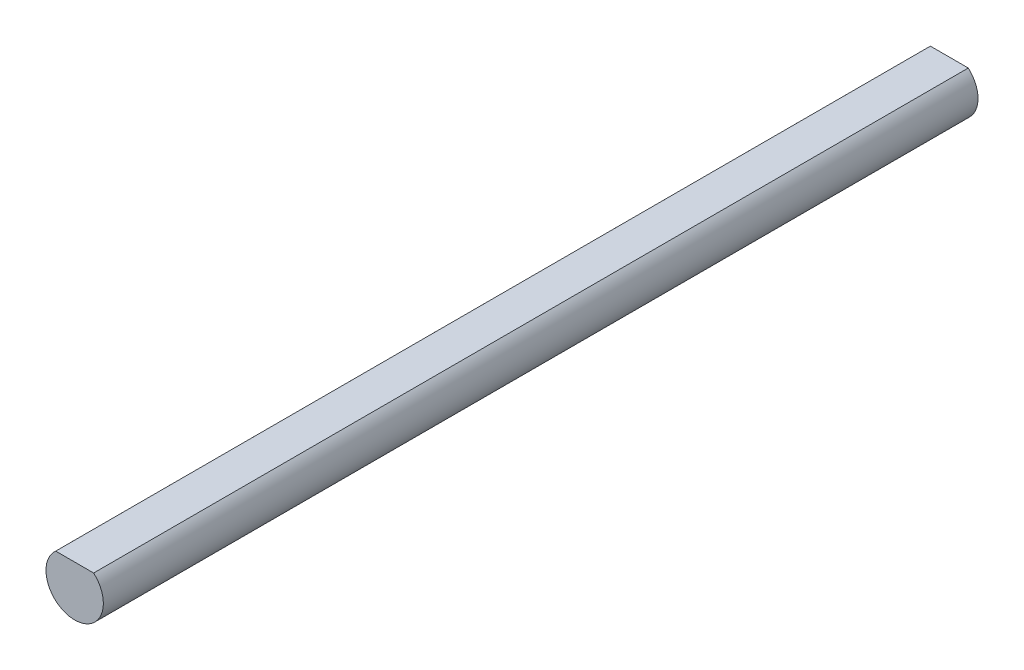
ISO-10303-21;
HEADER;
FILE_DESCRIPTION(('STEP AP214'),'2;1');
FILE_NAME('part.step','',(''),(''),'','','');
FILE_SCHEMA(('AUTOMOTIVE_DESIGN { 1 0 10303 214 1 1 1 1 }'));
ENDSEC;
DATA;
#1=APPLICATION_CONTEXT('core data for automotive mechanical design processes');
#2=APPLICATION_PROTOCOL_DEFINITION('international standard','automotive_design',2000,#1);
#3=PRODUCT_CONTEXT('',#1,'mechanical');
#4=PRODUCT('Part','Part','',(#3));
#5=PRODUCT_RELATED_PRODUCT_CATEGORY('part','',(#4));
#6=PRODUCT_DEFINITION_FORMATION('','',#4);
#7=PRODUCT_DEFINITION_CONTEXT('part definition',#1,'design');
#8=PRODUCT_DEFINITION('design','',#6,#7);
#9=PRODUCT_DEFINITION_SHAPE('','',#8);
#10=(LENGTH_UNIT() NAMED_UNIT(*) SI_UNIT(.MILLI.,.METRE.));
#11=(NAMED_UNIT(*) PLANE_ANGLE_UNIT() SI_UNIT($,.RADIAN.));
#12=(NAMED_UNIT(*) SI_UNIT($,.STERADIAN.) SOLID_ANGLE_UNIT());
#13=UNCERTAINTY_MEASURE_WITH_UNIT(LENGTH_MEASURE(1.E-05),#10,'distance_accuracy_value','');
#14=(GEOMETRIC_REPRESENTATION_CONTEXT(3) GLOBAL_UNCERTAINTY_ASSIGNED_CONTEXT((#13)) GLOBAL_UNIT_ASSIGNED_CONTEXT((#10,
#11,#12)) REPRESENTATION_CONTEXT('',''));
#15=CARTESIAN_POINT('',(0.,0.,0.));
#16=DIRECTION('',(0.,0.,1.));
#17=DIRECTION('',(1.,0.,0.));
#18=AXIS2_PLACEMENT_3D('',#15,#16,#17);
#19=CARTESIAN_POINT('',(0.,0.,-61.));
#20=DIRECTION('',(0.,0.,1.));
#21=DIRECTION('',(1.,0.,0.));
#22=AXIS2_PLACEMENT_3D('',#19,#20,#21);
#23=CYLINDRICAL_SURFACE('',#22,4.);
#24=DIRECTION('',(0.,0.,1.));
#25=VECTOR('',#24,1.);
#26=CARTESIAN_POINT('',(2.64575131106459,3.,-61.));
#27=LINE('',#26,#25);
#28=CARTESIAN_POINT('',(2.64575131106459,3.,-61.));
#29=VERTEX_POINT('',#28);
#30=CARTESIAN_POINT('',(2.64575131106459,3.,61.));
#31=VERTEX_POINT('',#30);
#32=EDGE_CURVE('E57',#29,#31,#27,.T.);
#33=ORIENTED_EDGE('',*,*,#32,.T.);
#34=CARTESIAN_POINT('',(0.,0.,61.));
#35=DIRECTION('',(0.,0.,1.));
#36=DIRECTION('',(1.,0.,0.));
#37=AXIS2_PLACEMENT_3D('',#34,#35,#36);
#38=CIRCLE('',#37,4.);
#39=CARTESIAN_POINT('',(-2.64575131106459,3.,61.));
#40=VERTEX_POINT('',#39);
#41=EDGE_CURVE('E44',#40,#31,#38,.T.);
#42=ORIENTED_EDGE('',*,*,#41,.F.);
#43=DIRECTION('',(0.,0.,1.));
#44=VECTOR('',#43,1.);
#45=CARTESIAN_POINT('',(-2.64575131106459,3.,-61.));
#46=LINE('',#45,#44);
#47=CARTESIAN_POINT('',(-2.64575131106459,3.,-61.));
#48=VERTEX_POINT('',#47);
#49=EDGE_CURVE('E51',#48,#40,#46,.T.);
#50=ORIENTED_EDGE('',*,*,#49,.F.);
#51=CARTESIAN_POINT('',(0.,0.,-61.));
#52=DIRECTION('',(0.,0.,1.));
#53=DIRECTION('',(1.,0.,0.));
#54=AXIS2_PLACEMENT_3D('',#51,#52,#53);
#55=CIRCLE('',#54,4.);
#56=EDGE_CURVE('E11',#48,#29,#55,.T.);
#57=ORIENTED_EDGE('',*,*,#56,.T.);
#58=EDGE_LOOP('',(#33,#42,#50,#57));
#59=FACE_BOUND('',#58,.T.);
#60=ADVANCED_FACE('F37',(#59),#23,.T.);
#61=CARTESIAN_POINT('',(0.,0.,-61.));
#62=DIRECTION('',(0.,0.,1.));
#63=DIRECTION('',(1.,0.,0.));
#64=AXIS2_PLACEMENT_3D('',#61,#62,#63);
#65=PLANE('',#64);
#66=ORIENTED_EDGE('',*,*,#56,.F.);
#67=DIRECTION('',(1.,0.,0.));
#68=VECTOR('',#67,1.);
#69=CARTESIAN_POINT('',(-2.64575131106459,3.,-61.));
#70=LINE('',#69,#68);
#71=EDGE_CURVE('E66',#48,#29,#70,.T.);
#72=ORIENTED_EDGE('',*,*,#71,.T.);
#73=EDGE_LOOP('',(#66,#72));
#74=FACE_BOUND('',#73,.T.);
#75=ADVANCED_FACE('F75',(#74),#65,.F.);
#76=CARTESIAN_POINT('',(0.,0.,61.));
#77=DIRECTION('',(0.,0.,1.));
#78=DIRECTION('',(1.,0.,0.));
#79=AXIS2_PLACEMENT_3D('',#76,#77,#78);
#80=PLANE('',#79);
#81=DIRECTION('',(1.,0.,0.));
#82=VECTOR('',#81,1.);
#83=CARTESIAN_POINT('',(-2.64575131106459,3.,61.));
#84=LINE('',#83,#82);
#85=EDGE_CURVE('E61',#40,#31,#84,.T.);
#86=ORIENTED_EDGE('',*,*,#85,.F.);
#87=ORIENTED_EDGE('',*,*,#41,.T.);
#88=EDGE_LOOP('',(#86,#87));
#89=FACE_BOUND('',#88,.T.);
#90=ADVANCED_FACE('F71',(#89),#80,.T.);
#91=CARTESIAN_POINT('',(-2.64575131106459,3.,-61.));
#92=DIRECTION('',(0.,-1.,0.));
#93=DIRECTION('',(0.,0.,-1.));
#94=AXIS2_PLACEMENT_3D('',#91,#92,#93);
#95=PLANE('',#94);
#96=ORIENTED_EDGE('',*,*,#85,.T.);
#97=ORIENTED_EDGE('',*,*,#32,.F.);
#98=ORIENTED_EDGE('',*,*,#71,.F.);
#99=ORIENTED_EDGE('',*,*,#49,.T.);
#100=EDGE_LOOP('',(#96,#97,#98,#99));
#101=FACE_BOUND('',#100,.T.);
#102=ADVANCED_FACE('F62',(#101),#95,.F.);
#103=CLOSED_SHELL('',(#60,#75,#90,#102));
#104=MANIFOLD_SOLID_BREP('B2',#103);
#105=ADVANCED_BREP_SHAPE_REPRESENTATION('',(#18,#104),#14);
#106=SHAPE_DEFINITION_REPRESENTATION(#9,#105);
ENDSEC;
END-ISO-10303-21;
